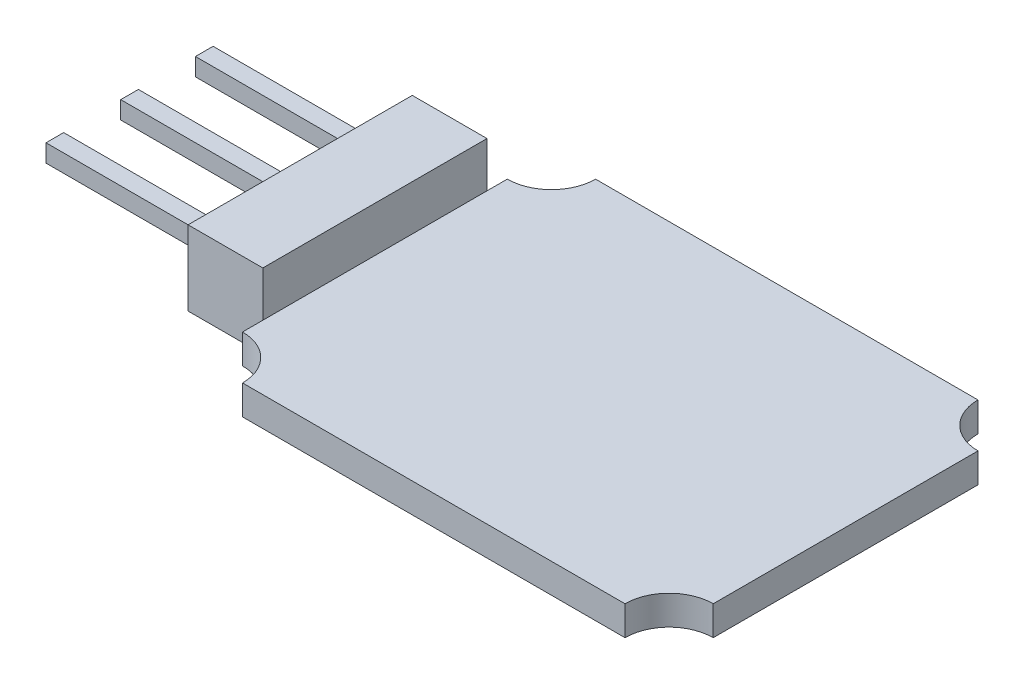
ISO-10303-21;
HEADER;
FILE_DESCRIPTION(('STEP AP214'),'2;1');
FILE_NAME('part.step','',(''),(''),'','','');
FILE_SCHEMA(('AUTOMOTIVE_DESIGN { 1 0 10303 214 1 1 1 1 }'));
ENDSEC;
DATA;
#1=APPLICATION_CONTEXT('core data for automotive mechanical design processes');
#2=APPLICATION_PROTOCOL_DEFINITION('international standard','automotive_design',2000,#1);
#3=PRODUCT_CONTEXT('',#1,'mechanical');
#4=PRODUCT('Part','Part','',(#3));
#5=PRODUCT_RELATED_PRODUCT_CATEGORY('part','',(#4));
#6=PRODUCT_DEFINITION_FORMATION('','',#4);
#7=PRODUCT_DEFINITION_CONTEXT('part definition',#1,'design');
#8=PRODUCT_DEFINITION('design','',#6,#7);
#9=PRODUCT_DEFINITION_SHAPE('','',#8);
#10=(LENGTH_UNIT() NAMED_UNIT(*) SI_UNIT(.MILLI.,.METRE.));
#11=(NAMED_UNIT(*) PLANE_ANGLE_UNIT() SI_UNIT($,.RADIAN.));
#12=(NAMED_UNIT(*) SI_UNIT($,.STERADIAN.) SOLID_ANGLE_UNIT());
#13=UNCERTAINTY_MEASURE_WITH_UNIT(LENGTH_MEASURE(1.E-05),#10,'distance_accuracy_value','');
#14=(GEOMETRIC_REPRESENTATION_CONTEXT(3) GLOBAL_UNCERTAINTY_ASSIGNED_CONTEXT((#13)) GLOBAL_UNIT_ASSIGNED_CONTEXT((#10,
#11,#12)) REPRESENTATION_CONTEXT('',''));
#15=CARTESIAN_POINT('',(0.,0.,0.));
#16=DIRECTION('',(0.,0.,1.));
#17=DIRECTION('',(1.,0.,0.));
#18=AXIS2_PLACEMENT_3D('',#15,#16,#17);
#19=CARTESIAN_POINT('',(-10.54,0.,-3.81));
#20=DIRECTION('',(1.,0.,0.));
#21=DIRECTION('',(0.,0.,-1.));
#22=AXIS2_PLACEMENT_3D('',#19,#20,#21);
#23=PLANE('',#22);
#24=DIRECTION('',(0.,-1.,0.));
#25=VECTOR('',#24,1.);
#26=CARTESIAN_POINT('',(-10.54,1.57,-0.3));
#27=LINE('',#26,#25);
#28=CARTESIAN_POINT('',(-10.54,1.57,-0.3));
#29=VERTEX_POINT('',#28);
#30=CARTESIAN_POINT('',(-10.54,0.970000000000001,-0.299999999999999));
#31=VERTEX_POINT('',#30);
#32=EDGE_CURVE('E271',#29,#31,#27,.T.);
#33=ORIENTED_EDGE('',*,*,#32,.F.);
#34=DIRECTION('',(0.,0.,-1.));
#35=VECTOR('',#34,1.);
#36=CARTESIAN_POINT('',(-10.54,1.57,-0.3));
#37=LINE('',#36,#35);
#38=CARTESIAN_POINT('',(-10.54,1.57,0.300000000000001));
#39=VERTEX_POINT('',#38);
#40=EDGE_CURVE('E280',#39,#29,#37,.T.);
#41=ORIENTED_EDGE('',*,*,#40,.F.);
#42=DIRECTION('',(0.,1.,0.));
#43=VECTOR('',#42,1.);
#44=CARTESIAN_POINT('',(-10.54,1.57,0.3));
#45=LINE('',#44,#43);
#46=CARTESIAN_POINT('',(-10.54,0.970000000000001,0.3));
#47=VERTEX_POINT('',#46);
#48=EDGE_CURVE('E277',#47,#39,#45,.T.);
#49=ORIENTED_EDGE('',*,*,#48,.F.);
#50=DIRECTION('',(0.,0.,1.));
#51=VECTOR('',#50,1.);
#52=CARTESIAN_POINT('',(-10.54,0.970000000000001,-0.3));
#53=LINE('',#52,#51);
#54=EDGE_CURVE('E274',#31,#47,#53,.T.);
#55=ORIENTED_EDGE('',*,*,#54,.F.);
#56=EDGE_LOOP('',(#33,#41,#49,#55));
#57=FACE_BOUND('',#56,.T.);
#58=DIRECTION('',(0.,1.,0.));
#59=VECTOR('',#58,1.);
#60=CARTESIAN_POINT('',(-10.54,0.,3.81));
#61=LINE('',#60,#59);
#62=CARTESIAN_POINT('',(-10.54,0.,3.81));
#63=VERTEX_POINT('',#62);
#64=CARTESIAN_POINT('',(-10.54,2.54,3.81));
#65=VERTEX_POINT('',#64);
#66=EDGE_CURVE('E329',#63,#65,#61,.T.);
#67=ORIENTED_EDGE('',*,*,#66,.T.);
#68=DIRECTION('',(0.,0.,1.));
#69=VECTOR('',#68,1.);
#70=CARTESIAN_POINT('',(-10.54,2.54,-3.81));
#71=LINE('',#70,#69);
#72=CARTESIAN_POINT('',(-10.54,2.54,-3.81));
#73=VERTEX_POINT('',#72);
#74=EDGE_CURVE('E334',#73,#65,#71,.T.);
#75=ORIENTED_EDGE('',*,*,#74,.F.);
#76=DIRECTION('',(0.,1.,0.));
#77=VECTOR('',#76,1.);
#78=CARTESIAN_POINT('',(-10.54,0.,-3.81));
#79=LINE('',#78,#77);
#80=CARTESIAN_POINT('',(-10.54,0.,-3.81));
#81=VERTEX_POINT('',#80);
#82=EDGE_CURVE('E319',#81,#73,#79,.T.);
#83=ORIENTED_EDGE('',*,*,#82,.F.);
#84=DIRECTION('',(0.,0.,1.));
#85=VECTOR('',#84,1.);
#86=CARTESIAN_POINT('',(-10.54,0.,-3.81));
#87=LINE('',#86,#85);
#88=EDGE_CURVE('E337',#81,#63,#87,.T.);
#89=ORIENTED_EDGE('',*,*,#88,.T.);
#90=EDGE_LOOP('',(#67,#75,#83,#89));
#91=FACE_BOUND('',#90,.T.);
#92=DIRECTION('',(0.,-1.,0.));
#93=VECTOR('',#92,1.);
#94=CARTESIAN_POINT('',(-10.54,1.57,-2.84));
#95=LINE('',#94,#93);
#96=CARTESIAN_POINT('',(-10.54,1.57,-2.84));
#97=VERTEX_POINT('',#96);
#98=CARTESIAN_POINT('',(-10.54,0.970000000000001,-2.84));
#99=VERTEX_POINT('',#98);
#100=EDGE_CURVE('E291',#97,#99,#95,.T.);
#101=ORIENTED_EDGE('',*,*,#100,.F.);
#102=DIRECTION('',(0.,0.,-1.));
#103=VECTOR('',#102,1.);
#104=CARTESIAN_POINT('',(-10.54,1.57,-2.84));
#105=LINE('',#104,#103);
#106=CARTESIAN_POINT('',(-10.54,1.57,-2.24));
#107=VERTEX_POINT('',#106);
#108=EDGE_CURVE('E300',#107,#97,#105,.T.);
#109=ORIENTED_EDGE('',*,*,#108,.F.);
#110=DIRECTION('',(0.,1.,0.));
#111=VECTOR('',#110,1.);
#112=CARTESIAN_POINT('',(-10.54,1.57,-2.24));
#113=LINE('',#112,#111);
#114=CARTESIAN_POINT('',(-10.54,0.970000000000001,-2.24));
#115=VERTEX_POINT('',#114);
#116=EDGE_CURVE('E297',#115,#107,#113,.T.);
#117=ORIENTED_EDGE('',*,*,#116,.F.);
#118=DIRECTION('',(0.,0.,1.));
#119=VECTOR('',#118,1.);
#120=CARTESIAN_POINT('',(-10.54,0.970000000000001,-2.84));
#121=LINE('',#120,#119);
#122=EDGE_CURVE('E294',#99,#115,#121,.T.);
#123=ORIENTED_EDGE('',*,*,#122,.F.);
#124=EDGE_LOOP('',(#101,#109,#117,#123));
#125=FACE_BOUND('',#124,.T.);
#126=DIRECTION('',(0.,-1.,0.));
#127=VECTOR('',#126,1.);
#128=CARTESIAN_POINT('',(-10.54,1.57,2.24));
#129=LINE('',#128,#127);
#130=CARTESIAN_POINT('',(-10.54,1.57,2.24));
#131=VERTEX_POINT('',#130);
#132=CARTESIAN_POINT('',(-10.54,0.970000000000001,2.24));
#133=VERTEX_POINT('',#132);
#134=EDGE_CURVE('E240',#131,#133,#129,.T.);
#135=ORIENTED_EDGE('',*,*,#134,.F.);
#136=DIRECTION('',(0.,0.,-1.));
#137=VECTOR('',#136,1.);
#138=CARTESIAN_POINT('',(-10.54,1.57,2.24));
#139=LINE('',#138,#137);
#140=CARTESIAN_POINT('',(-10.54,1.57,2.84));
#141=VERTEX_POINT('',#140);
#142=EDGE_CURVE('E248',#141,#131,#139,.T.);
#143=ORIENTED_EDGE('',*,*,#142,.F.);
#144=DIRECTION('',(0.,1.,0.));
#145=VECTOR('',#144,1.);
#146=CARTESIAN_POINT('',(-10.54,1.57,2.84));
#147=LINE('',#146,#145);
#148=CARTESIAN_POINT('',(-10.54,0.970000000000001,2.84));
#149=VERTEX_POINT('',#148);
#150=EDGE_CURVE('E261',#149,#141,#147,.T.);
#151=ORIENTED_EDGE('',*,*,#150,.F.);
#152=DIRECTION('',(0.,0.,1.));
#153=VECTOR('',#152,1.);
#154=CARTESIAN_POINT('',(-10.54,0.970000000000001,2.24));
#155=LINE('',#154,#153);
#156=EDGE_CURVE('E256',#133,#149,#155,.T.);
#157=ORIENTED_EDGE('',*,*,#156,.F.);
#158=EDGE_LOOP('',(#135,#143,#151,#157));
#159=FACE_BOUND('',#158,.T.);
#160=ADVANCED_FACE('F32',(#57,#91,#125,#159),#23,.F.);
#161=CARTESIAN_POINT('',(-8.,1.,4.5));
#162=DIRECTION('',(1.,0.,0.));
#163=DIRECTION('',(0.,0.,-1.));
#164=AXIS2_PLACEMENT_3D('',#161,#162,#163);
#165=PLANE('',#164);
#166=DIRECTION('',(0.,-1.,0.));
#167=VECTOR('',#166,1.);
#168=CARTESIAN_POINT('',(-8.,0.,-3.81));
#169=LINE('',#168,#167);
#170=CARTESIAN_POINT('',(-8.,1.,-3.81));
#171=VERTEX_POINT('',#170);
#172=CARTESIAN_POINT('',(-8.,0.,-3.81));
#173=VERTEX_POINT('',#172);
#174=EDGE_CURVE('E317',#171,#173,#169,.T.);
#175=ORIENTED_EDGE('',*,*,#174,.F.);
#176=DIRECTION('',(0.,0.,1.));
#177=VECTOR('',#176,1.);
#178=CARTESIAN_POINT('',(-8.,1.,4.5));
#179=LINE('',#178,#177);
#180=CARTESIAN_POINT('',(-8.,1.,-4.5));
#181=VERTEX_POINT('',#180);
#182=EDGE_CURVE('E358',#181,#171,#179,.T.);
#183=ORIENTED_EDGE('',*,*,#182,.F.);
#184=DIRECTION('',(0.,-1.,0.));
#185=VECTOR('',#184,1.);
#186=CARTESIAN_POINT('',(-8.,1.,-4.5));
#187=LINE('',#186,#185);
#188=CARTESIAN_POINT('',(-8.,0.,-4.5));
#189=VERTEX_POINT('',#188);
#190=EDGE_CURVE('E381',#181,#189,#187,.T.);
#191=ORIENTED_EDGE('',*,*,#190,.T.);
#192=DIRECTION('',(0.,0.,1.));
#193=VECTOR('',#192,1.);
#194=CARTESIAN_POINT('',(-8.,0.,4.5));
#195=LINE('',#194,#193);
#196=EDGE_CURVE('E345',#189,#173,#195,.T.);
#197=ORIENTED_EDGE('',*,*,#196,.T.);
#198=EDGE_LOOP('',(#175,#183,#191,#197));
#199=FACE_BOUND('',#198,.T.);
#200=ADVANCED_FACE('F514',(#199),#165,.F.);
#201=CARTESIAN_POINT('',(-8.,1.,6.));
#202=DIRECTION('',(0.,-1.,0.));
#203=DIRECTION('',(0.,0.,-1.));
#204=AXIS2_PLACEMENT_3D('',#201,#202,#203);
#205=CYLINDRICAL_SURFACE('',#204,1.5);
#206=CARTESIAN_POINT('',(-8.,0.,6.));
#207=DIRECTION('',(0.,-1.,0.));
#208=DIRECTION('',(0.,0.,1.));
#209=AXIS2_PLACEMENT_3D('',#206,#207,#208);
#210=CIRCLE('',#209,1.5);
#211=CARTESIAN_POINT('',(-8.,0.,4.5));
#212=VERTEX_POINT('',#211);
#213=CARTESIAN_POINT('',(-6.5,0.,6.));
#214=VERTEX_POINT('',#213);
#215=EDGE_CURVE('E340',#212,#214,#210,.T.);
#216=ORIENTED_EDGE('',*,*,#215,.T.);
#217=DIRECTION('',(0.,-1.,0.));
#218=VECTOR('',#217,1.);
#219=CARTESIAN_POINT('',(-6.5,1.,6.));
#220=LINE('',#219,#218);
#221=CARTESIAN_POINT('',(-6.5,1.,6.));
#222=VERTEX_POINT('',#221);
#223=EDGE_CURVE('E399',#222,#214,#220,.T.);
#224=ORIENTED_EDGE('',*,*,#223,.F.);
#225=CARTESIAN_POINT('',(-8.,1.,6.));
#226=DIRECTION('',(0.,-1.,0.));
#227=DIRECTION('',(0.,0.,1.));
#228=AXIS2_PLACEMENT_3D('',#225,#226,#227);
#229=CIRCLE('',#228,1.5);
#230=CARTESIAN_POINT('',(-8.,1.,4.5));
#231=VERTEX_POINT('',#230);
#232=EDGE_CURVE('E341',#231,#222,#229,.T.);
#233=ORIENTED_EDGE('',*,*,#232,.F.);
#234=DIRECTION('',(0.,-1.,0.));
#235=VECTOR('',#234,1.);
#236=CARTESIAN_POINT('',(-8.,1.,4.5));
#237=LINE('',#236,#235);
#238=EDGE_CURVE('E361',#231,#212,#237,.T.);
#239=ORIENTED_EDGE('',*,*,#238,.T.);
#240=EDGE_LOOP('',(#216,#224,#233,#239));
#241=FACE_BOUND('',#240,.T.);
#242=ADVANCED_FACE('F520',(#241),#205,.F.);
#243=CARTESIAN_POINT('',(-6.5,1.,6.));
#244=DIRECTION('',(0.,0.,-1.));
#245=DIRECTION('',(-1.,0.,0.));
#246=AXIS2_PLACEMENT_3D('',#243,#244,#245);
#247=PLANE('',#246);
#248=DIRECTION('',(1.,0.,0.));
#249=VECTOR('',#248,1.);
#250=CARTESIAN_POINT('',(-6.5,0.,6.));
#251=LINE('',#250,#249);
#252=CARTESIAN_POINT('',(6.5,0.,6.));
#253=VERTEX_POINT('',#252);
#254=EDGE_CURVE('E365',#214,#253,#251,.T.);
#255=ORIENTED_EDGE('',*,*,#254,.T.);
#256=DIRECTION('',(0.,-1.,0.));
#257=VECTOR('',#256,1.);
#258=CARTESIAN_POINT('',(6.5,1.,6.));
#259=LINE('',#258,#257);
#260=CARTESIAN_POINT('',(6.5,1.,6.));
#261=VERTEX_POINT('',#260);
#262=EDGE_CURVE('E396',#261,#253,#259,.T.);
#263=ORIENTED_EDGE('',*,*,#262,.F.);
#264=DIRECTION('',(1.,0.,0.));
#265=VECTOR('',#264,1.);
#266=CARTESIAN_POINT('',(-6.5,1.,6.));
#267=LINE('',#266,#265);
#268=EDGE_CURVE('E344',#222,#261,#267,.T.);
#269=ORIENTED_EDGE('',*,*,#268,.F.);
#270=ORIENTED_EDGE('',*,*,#223,.T.);
#271=EDGE_LOOP('',(#255,#263,#269,#270));
#272=FACE_BOUND('',#271,.T.);
#273=ADVANCED_FACE('F563',(#272),#247,.F.);
#274=CARTESIAN_POINT('',(8.,1.,6.));
#275=DIRECTION('',(0.,-1.,0.));
#276=DIRECTION('',(0.,0.,-1.));
#277=AXIS2_PLACEMENT_3D('',#274,#275,#276);
#278=CYLINDRICAL_SURFACE('',#277,1.5);
#279=CARTESIAN_POINT('',(8.,0.,6.));
#280=DIRECTION('',(0.,-1.,0.));
#281=DIRECTION('',(0.,0.,1.));
#282=AXIS2_PLACEMENT_3D('',#279,#280,#281);
#283=CIRCLE('',#282,1.5);
#284=CARTESIAN_POINT('',(8.,0.,4.5));
#285=VERTEX_POINT('',#284);
#286=EDGE_CURVE('E367',#253,#285,#283,.T.);
#287=ORIENTED_EDGE('',*,*,#286,.T.);
#288=DIRECTION('',(0.,-1.,0.));
#289=VECTOR('',#288,1.);
#290=CARTESIAN_POINT('',(8.,1.,4.5));
#291=LINE('',#290,#289);
#292=CARTESIAN_POINT('',(8.,1.,4.5));
#293=VERTEX_POINT('',#292);
#294=EDGE_CURVE('E393',#293,#285,#291,.T.);
#295=ORIENTED_EDGE('',*,*,#294,.F.);
#296=CARTESIAN_POINT('',(8.,1.,6.));
#297=DIRECTION('',(0.,-1.,0.));
#298=DIRECTION('',(0.,0.,1.));
#299=AXIS2_PLACEMENT_3D('',#296,#297,#298);
#300=CIRCLE('',#299,1.5);
#301=EDGE_CURVE('E347',#261,#293,#300,.T.);
#302=ORIENTED_EDGE('',*,*,#301,.F.);
#303=ORIENTED_EDGE('',*,*,#262,.T.);
#304=EDGE_LOOP('',(#287,#295,#302,#303));
#305=FACE_BOUND('',#304,.T.);
#306=ADVANCED_FACE('F559',(#305),#278,.F.);
#307=CARTESIAN_POINT('',(8.,1.,4.5));
#308=DIRECTION('',(-1.,0.,0.));
#309=DIRECTION('',(0.,0.,1.));
#310=AXIS2_PLACEMENT_3D('',#307,#308,#309);
#311=PLANE('',#310);
#312=DIRECTION('',(0.,0.,-1.));
#313=VECTOR('',#312,1.);
#314=CARTESIAN_POINT('',(8.,0.,4.5));
#315=LINE('',#314,#313);
#316=CARTESIAN_POINT('',(8.,0.,-4.5));
#317=VERTEX_POINT('',#316);
#318=EDGE_CURVE('E369',#285,#317,#315,.T.);
#319=ORIENTED_EDGE('',*,*,#318,.T.);
#320=DIRECTION('',(0.,-1.,0.));
#321=VECTOR('',#320,1.);
#322=CARTESIAN_POINT('',(8.,1.,-4.5));
#323=LINE('',#322,#321);
#324=CARTESIAN_POINT('',(8.,1.,-4.5));
#325=VERTEX_POINT('',#324);
#326=EDGE_CURVE('E390',#325,#317,#323,.T.);
#327=ORIENTED_EDGE('',*,*,#326,.F.);
#328=DIRECTION('',(0.,0.,-1.));
#329=VECTOR('',#328,1.);
#330=CARTESIAN_POINT('',(8.,1.,4.5));
#331=LINE('',#330,#329);
#332=EDGE_CURVE('E349',#293,#325,#331,.T.);
#333=ORIENTED_EDGE('',*,*,#332,.F.);
#334=ORIENTED_EDGE('',*,*,#294,.T.);
#335=EDGE_LOOP('',(#319,#327,#333,#334));
#336=FACE_BOUND('',#335,.T.);
#337=ADVANCED_FACE('F555',(#336),#311,.F.);
#338=CARTESIAN_POINT('',(8.,1.,-6.));
#339=DIRECTION('',(0.,-1.,0.));
#340=DIRECTION('',(0.,0.,-1.));
#341=AXIS2_PLACEMENT_3D('',#338,#339,#340);
#342=CYLINDRICAL_SURFACE('',#341,1.5);
#343=CARTESIAN_POINT('',(8.,0.,-6.));
#344=DIRECTION('',(0.,-1.,0.));
#345=DIRECTION('',(0.,0.,1.));
#346=AXIS2_PLACEMENT_3D('',#343,#344,#345);
#347=CIRCLE('',#346,1.5);
#348=CARTESIAN_POINT('',(6.5,0.,-6.));
#349=VERTEX_POINT('',#348);
#350=EDGE_CURVE('E371',#317,#349,#347,.T.);
#351=ORIENTED_EDGE('',*,*,#350,.T.);
#352=DIRECTION('',(0.,-1.,0.));
#353=VECTOR('',#352,1.);
#354=CARTESIAN_POINT('',(6.5,1.,-6.));
#355=LINE('',#354,#353);
#356=CARTESIAN_POINT('',(6.5,1.,-6.));
#357=VERTEX_POINT('',#356);
#358=EDGE_CURVE('E387',#357,#349,#355,.T.);
#359=ORIENTED_EDGE('',*,*,#358,.F.);
#360=CARTESIAN_POINT('',(8.,1.,-6.));
#361=DIRECTION('',(0.,-1.,0.));
#362=DIRECTION('',(0.,0.,1.));
#363=AXIS2_PLACEMENT_3D('',#360,#361,#362);
#364=CIRCLE('',#363,1.5);
#365=EDGE_CURVE('E351',#325,#357,#364,.T.);
#366=ORIENTED_EDGE('',*,*,#365,.F.);
#367=ORIENTED_EDGE('',*,*,#326,.T.);
#368=EDGE_LOOP('',(#351,#359,#366,#367));
#369=FACE_BOUND('',#368,.T.);
#370=ADVANCED_FACE('F551',(#369),#342,.F.);
#371=CARTESIAN_POINT('',(-6.5,1.,-6.));
#372=DIRECTION('',(0.,0.,1.));
#373=DIRECTION('',(1.,0.,0.));
#374=AXIS2_PLACEMENT_3D('',#371,#372,#373);
#375=PLANE('',#374);
#376=DIRECTION('',(-1.,0.,0.));
#377=VECTOR('',#376,1.);
#378=CARTESIAN_POINT('',(-6.5,0.,-6.));
#379=LINE('',#378,#377);
#380=CARTESIAN_POINT('',(-6.5,0.,-6.));
#381=VERTEX_POINT('',#380);
#382=EDGE_CURVE('E373',#349,#381,#379,.T.);
#383=ORIENTED_EDGE('',*,*,#382,.T.);
#384=DIRECTION('',(0.,-1.,0.));
#385=VECTOR('',#384,1.);
#386=CARTESIAN_POINT('',(-6.5,1.,-6.));
#387=LINE('',#386,#385);
#388=CARTESIAN_POINT('',(-6.5,1.,-6.));
#389=VERTEX_POINT('',#388);
#390=EDGE_CURVE('E384',#389,#381,#387,.T.);
#391=ORIENTED_EDGE('',*,*,#390,.F.);
#392=DIRECTION('',(-1.,0.,0.));
#393=VECTOR('',#392,1.);
#394=CARTESIAN_POINT('',(-6.5,1.,-6.));
#395=LINE('',#394,#393);
#396=EDGE_CURVE('E353',#357,#389,#395,.T.);
#397=ORIENTED_EDGE('',*,*,#396,.F.);
#398=ORIENTED_EDGE('',*,*,#358,.T.);
#399=EDGE_LOOP('',(#383,#391,#397,#398));
#400=FACE_BOUND('',#399,.T.);
#401=ADVANCED_FACE('F547',(#400),#375,.F.);
#402=CARTESIAN_POINT('',(-8.,1.,-6.));
#403=DIRECTION('',(0.,-1.,0.));
#404=DIRECTION('',(0.,0.,-1.));
#405=AXIS2_PLACEMENT_3D('',#402,#403,#404);
#406=CYLINDRICAL_SURFACE('',#405,1.5);
#407=CARTESIAN_POINT('',(-8.,0.,-6.));
#408=DIRECTION('',(0.,-1.,0.));
#409=DIRECTION('',(0.,0.,1.));
#410=AXIS2_PLACEMENT_3D('',#407,#408,#409);
#411=CIRCLE('',#410,1.5);
#412=EDGE_CURVE('E375',#381,#189,#411,.T.);
#413=ORIENTED_EDGE('',*,*,#412,.T.);
#414=ORIENTED_EDGE('',*,*,#190,.F.);
#415=CARTESIAN_POINT('',(-8.,1.,-6.));
#416=DIRECTION('',(0.,-1.,0.));
#417=DIRECTION('',(0.,0.,1.));
#418=AXIS2_PLACEMENT_3D('',#415,#416,#417);
#419=CIRCLE('',#418,1.5);
#420=EDGE_CURVE('E355',#389,#181,#419,.T.);
#421=ORIENTED_EDGE('',*,*,#420,.F.);
#422=ORIENTED_EDGE('',*,*,#390,.T.);
#423=EDGE_LOOP('',(#413,#414,#421,#422));
#424=FACE_BOUND('',#423,.T.);
#425=ADVANCED_FACE('F543',(#424),#406,.F.);
#426=CARTESIAN_POINT('',(-8.,1.,3.81));
#427=VERTEX_POINT('',#426);
#428=EDGE_CURVE('E357',#427,#231,#179,.T.);
#429=ORIENTED_EDGE('',*,*,#428,.F.);
#430=DIRECTION('',(0.,-1.,0.));
#431=VECTOR('',#430,1.);
#432=CARTESIAN_POINT('',(-8.,0.,3.81));
#433=LINE('',#432,#431);
#434=CARTESIAN_POINT('',(-8.,0.,3.81));
#435=VERTEX_POINT('',#434);
#436=EDGE_CURVE('E327',#427,#435,#433,.T.);
#437=ORIENTED_EDGE('',*,*,#436,.T.);
#438=EDGE_CURVE('E377',#435,#212,#195,.T.);
#439=ORIENTED_EDGE('',*,*,#438,.T.);
#440=ORIENTED_EDGE('',*,*,#238,.F.);
#441=EDGE_LOOP('',(#429,#437,#439,#440));
#442=FACE_BOUND('',#441,.T.);
#443=ADVANCED_FACE('F523',(#442),#165,.F.);
#444=CARTESIAN_POINT('',(-8.,1.,6.));
#445=DIRECTION('',(0.,1.,0.));
#446=DIRECTION('',(0.,0.,1.));
#447=AXIS2_PLACEMENT_3D('',#444,#445,#446);
#448=PLANE('',#447);
#449=ORIENTED_EDGE('',*,*,#232,.T.);
#450=ORIENTED_EDGE('',*,*,#268,.T.);
#451=ORIENTED_EDGE('',*,*,#301,.T.);
#452=ORIENTED_EDGE('',*,*,#332,.T.);
#453=ORIENTED_EDGE('',*,*,#365,.T.);
#454=ORIENTED_EDGE('',*,*,#396,.T.);
#455=ORIENTED_EDGE('',*,*,#420,.T.);
#456=ORIENTED_EDGE('',*,*,#182,.T.);
#457=EDGE_CURVE('E362',#171,#427,#179,.T.);
#458=ORIENTED_EDGE('',*,*,#457,.T.);
#459=ORIENTED_EDGE('',*,*,#428,.T.);
#460=EDGE_LOOP('',(#449,#450,#451,#452,#453,#454,#455,#456,#458,#459));
#461=FACE_BOUND('',#460,.T.);
#462=ADVANCED_FACE('F535',(#461),#448,.T.);
#463=CARTESIAN_POINT('',(-8.,0.,6.));
#464=DIRECTION('',(0.,1.,0.));
#465=DIRECTION('',(0.,0.,1.));
#466=AXIS2_PLACEMENT_3D('',#463,#464,#465);
#467=PLANE('',#466);
#468=ORIENTED_EDGE('',*,*,#215,.F.);
#469=ORIENTED_EDGE('',*,*,#438,.F.);
#470=DIRECTION('',(-1.,0.,0.));
#471=VECTOR('',#470,1.);
#472=CARTESIAN_POINT('',(-8.,0.,3.81));
#473=LINE('',#472,#471);
#474=EDGE_CURVE('E326',#435,#63,#473,.T.);
#475=ORIENTED_EDGE('',*,*,#474,.T.);
#476=ORIENTED_EDGE('',*,*,#88,.F.);
#477=DIRECTION('',(-1.,0.,0.));
#478=VECTOR('',#477,1.);
#479=CARTESIAN_POINT('',(-8.,0.,-3.81));
#480=LINE('',#479,#478);
#481=EDGE_CURVE('E315',#173,#81,#480,.T.);
#482=ORIENTED_EDGE('',*,*,#481,.F.);
#483=ORIENTED_EDGE('',*,*,#196,.F.);
#484=ORIENTED_EDGE('',*,*,#412,.F.);
#485=ORIENTED_EDGE('',*,*,#382,.F.);
#486=ORIENTED_EDGE('',*,*,#350,.F.);
#487=ORIENTED_EDGE('',*,*,#318,.F.);
#488=ORIENTED_EDGE('',*,*,#286,.F.);
#489=ORIENTED_EDGE('',*,*,#254,.F.);
#490=EDGE_LOOP('',(#468,#469,#475,#476,#482,#483,#484,#485,#486,#487,#488,#489));
#491=FACE_BOUND('',#490,.T.);
#492=ADVANCED_FACE('F533',(#491),#467,.F.);
#493=CARTESIAN_POINT('',(-8.,0.,-3.81));
#494=DIRECTION('',(-1.,0.,0.));
#495=DIRECTION('',(0.,0.,1.));
#496=AXIS2_PLACEMENT_3D('',#493,#494,#495);
#497=PLANE('',#496);
#498=ORIENTED_EDGE('',*,*,#457,.F.);
#499=CARTESIAN_POINT('',(-8.,2.54,-3.81));
#500=VERTEX_POINT('',#499);
#501=EDGE_CURVE('E312',#500,#171,#169,.T.);
#502=ORIENTED_EDGE('',*,*,#501,.F.);
#503=DIRECTION('',(0.,0.,1.));
#504=VECTOR('',#503,1.);
#505=CARTESIAN_POINT('',(-8.,2.54,-3.81));
#506=LINE('',#505,#504);
#507=CARTESIAN_POINT('',(-8.,2.54,3.81));
#508=VERTEX_POINT('',#507);
#509=EDGE_CURVE('E323',#500,#508,#506,.T.);
#510=ORIENTED_EDGE('',*,*,#509,.T.);
#511=EDGE_CURVE('E311',#508,#427,#433,.T.);
#512=ORIENTED_EDGE('',*,*,#511,.T.);
#513=EDGE_LOOP('',(#498,#502,#510,#512));
#514=FACE_BOUND('',#513,.T.);
#515=ADVANCED_FACE('F530',(#514),#497,.F.);
#516=CARTESIAN_POINT('',(-8.,2.54,-3.81));
#517=DIRECTION('',(0.,-1.,0.));
#518=DIRECTION('',(0.,0.,-1.));
#519=AXIS2_PLACEMENT_3D('',#516,#517,#518);
#520=PLANE('',#519);
#521=DIRECTION('',(1.,0.,0.));
#522=VECTOR('',#521,1.);
#523=CARTESIAN_POINT('',(-8.,2.54,3.81));
#524=LINE('',#523,#522);
#525=EDGE_CURVE('E316',#65,#508,#524,.T.);
#526=ORIENTED_EDGE('',*,*,#525,.T.);
#527=ORIENTED_EDGE('',*,*,#509,.F.);
#528=DIRECTION('',(1.,0.,0.));
#529=VECTOR('',#528,1.);
#530=CARTESIAN_POINT('',(-8.,2.54,-3.81));
#531=LINE('',#530,#529);
#532=EDGE_CURVE('E321',#73,#500,#531,.T.);
#533=ORIENTED_EDGE('',*,*,#532,.F.);
#534=ORIENTED_EDGE('',*,*,#74,.T.);
#535=EDGE_LOOP('',(#526,#527,#533,#534));
#536=FACE_BOUND('',#535,.T.);
#537=ADVANCED_FACE('F528',(#536),#520,.F.);
#538=CARTESIAN_POINT('',(0.,0.,-3.81));
#539=DIRECTION('',(0.,0.,1.));
#540=DIRECTION('',(1.,0.,0.));
#541=AXIS2_PLACEMENT_3D('',#538,#539,#540);
#542=PLANE('',#541);
#543=ORIENTED_EDGE('',*,*,#501,.T.);
#544=ORIENTED_EDGE('',*,*,#174,.T.);
#545=ORIENTED_EDGE('',*,*,#481,.T.);
#546=ORIENTED_EDGE('',*,*,#82,.T.);
#547=ORIENTED_EDGE('',*,*,#532,.T.);
#548=EDGE_LOOP('',(#543,#544,#545,#546,#547));
#549=FACE_BOUND('',#548,.T.);
#550=ADVANCED_FACE('F764',(#549),#542,.F.);
#551=CARTESIAN_POINT('',(0.,0.,3.81));
#552=DIRECTION('',(0.,0.,1.));
#553=DIRECTION('',(1.,0.,0.));
#554=AXIS2_PLACEMENT_3D('',#551,#552,#553);
#555=PLANE('',#554);
#556=ORIENTED_EDGE('',*,*,#511,.F.);
#557=ORIENTED_EDGE('',*,*,#525,.F.);
#558=ORIENTED_EDGE('',*,*,#66,.F.);
#559=ORIENTED_EDGE('',*,*,#474,.F.);
#560=ORIENTED_EDGE('',*,*,#436,.F.);
#561=EDGE_LOOP('',(#556,#557,#558,#559,#560));
#562=FACE_BOUND('',#561,.T.);
#563=ADVANCED_FACE('F750',(#562),#555,.T.);
#564=CARTESIAN_POINT('',(-16.54,1.57,-2.84));
#565=DIRECTION('',(0.,0.,1.));
#566=DIRECTION('',(1.,0.,0.));
#567=AXIS2_PLACEMENT_3D('',#564,#565,#566);
#568=PLANE('',#567);
#569=DIRECTION('',(1.,0.,0.));
#570=VECTOR('',#569,1.);
#571=CARTESIAN_POINT('',(-16.54,0.970000000000001,-2.84));
#572=LINE('',#571,#570);
#573=CARTESIAN_POINT('',(-16.34,0.970000000000001,-2.84));
#574=VERTEX_POINT('',#573);
#575=EDGE_CURVE('E309',#574,#99,#572,.T.);
#576=ORIENTED_EDGE('',*,*,#575,.F.);
#577=DIRECTION('',(0.,1.,0.));
#578=VECTOR('',#577,1.);
#579=CARTESIAN_POINT('',(-16.34,1.57,-2.84));
#580=LINE('',#579,#578);
#581=CARTESIAN_POINT('',(-16.34,1.57,-2.84));
#582=VERTEX_POINT('',#581);
#583=EDGE_CURVE('E11',#574,#582,#580,.T.);
#584=ORIENTED_EDGE('',*,*,#583,.T.);
#585=DIRECTION('',(1.,0.,0.));
#586=VECTOR('',#585,1.);
#587=CARTESIAN_POINT('',(-16.54,1.57,-2.84));
#588=LINE('',#587,#586);
#589=EDGE_CURVE('E303',#582,#97,#588,.T.);
#590=ORIENTED_EDGE('',*,*,#589,.T.);
#591=ORIENTED_EDGE('',*,*,#100,.T.);
#592=EDGE_LOOP('',(#576,#584,#590,#591));
#593=FACE_BOUND('',#592,.T.);
#594=ADVANCED_FACE('F490',(#593),#568,.F.);
#595=CARTESIAN_POINT('',(-16.54,0.970000000000001,-2.84));
#596=DIRECTION('',(0.,1.,0.));
#597=DIRECTION('',(0.,0.,1.));
#598=AXIS2_PLACEMENT_3D('',#595,#596,#597);
#599=PLANE('',#598);
#600=DIRECTION('',(1.,0.,0.));
#601=VECTOR('',#600,1.);
#602=CARTESIAN_POINT('',(-16.54,0.970000000000001,-2.24));
#603=LINE('',#602,#601);
#604=CARTESIAN_POINT('',(-16.34,0.970000000000001,-2.24));
#605=VERTEX_POINT('',#604);
#606=EDGE_CURVE('E307',#605,#115,#603,.T.);
#607=ORIENTED_EDGE('',*,*,#606,.F.);
#608=DIRECTION('',(0.,0.,-1.));
#609=VECTOR('',#608,1.);
#610=CARTESIAN_POINT('',(-16.34,0.970000000000001,-2.84));
#611=LINE('',#610,#609);
#612=EDGE_CURVE('E41',#605,#574,#611,.T.);
#613=ORIENTED_EDGE('',*,*,#612,.T.);
#614=ORIENTED_EDGE('',*,*,#575,.T.);
#615=ORIENTED_EDGE('',*,*,#122,.T.);
#616=EDGE_LOOP('',(#607,#613,#614,#615));
#617=FACE_BOUND('',#616,.T.);
#618=ADVANCED_FACE('F734',(#617),#599,.F.);
#619=CARTESIAN_POINT('',(-16.54,1.57,-2.24));
#620=DIRECTION('',(0.,0.,-1.));
#621=DIRECTION('',(-1.,0.,0.));
#622=AXIS2_PLACEMENT_3D('',#619,#620,#621);
#623=PLANE('',#622);
#624=DIRECTION('',(1.,0.,0.));
#625=VECTOR('',#624,1.);
#626=CARTESIAN_POINT('',(-16.54,1.57,-2.24));
#627=LINE('',#626,#625);
#628=CARTESIAN_POINT('',(-16.34,1.57,-2.24));
#629=VERTEX_POINT('',#628);
#630=EDGE_CURVE('E305',#629,#107,#627,.T.);
#631=ORIENTED_EDGE('',*,*,#630,.F.);
#632=DIRECTION('',(0.,-1.,0.));
#633=VECTOR('',#632,1.);
#634=CARTESIAN_POINT('',(-16.34,0.970000000000001,-2.24));
#635=LINE('',#634,#633);
#636=EDGE_CURVE('E56',#629,#605,#635,.T.);
#637=ORIENTED_EDGE('',*,*,#636,.T.);
#638=ORIENTED_EDGE('',*,*,#606,.T.);
#639=ORIENTED_EDGE('',*,*,#116,.T.);
#640=EDGE_LOOP('',(#631,#637,#638,#639));
#641=FACE_BOUND('',#640,.T.);
#642=ADVANCED_FACE('F511',(#641),#623,.F.);
#643=CARTESIAN_POINT('',(-16.54,1.57,-2.84));
#644=DIRECTION('',(0.,-1.,0.));
#645=DIRECTION('',(0.,0.,-1.));
#646=AXIS2_PLACEMENT_3D('',#643,#644,#645);
#647=PLANE('',#646);
#648=ORIENTED_EDGE('',*,*,#589,.F.);
#649=DIRECTION('',(0.,0.,1.));
#650=VECTOR('',#649,1.);
#651=CARTESIAN_POINT('',(-16.34,1.57,-2.24));
#652=LINE('',#651,#650);
#653=EDGE_CURVE('E445',#582,#629,#652,.T.);
#654=ORIENTED_EDGE('',*,*,#653,.T.);
#655=ORIENTED_EDGE('',*,*,#630,.T.);
#656=ORIENTED_EDGE('',*,*,#108,.T.);
#657=EDGE_LOOP('',(#648,#654,#655,#656));
#658=FACE_BOUND('',#657,.T.);
#659=ADVANCED_FACE('F494',(#658),#647,.F.);
#660=CARTESIAN_POINT('',(-16.54,0.,0.));
#661=DIRECTION('',(-1.,0.,0.));
#662=DIRECTION('',(0.,0.,1.));
#663=AXIS2_PLACEMENT_3D('',#660,#661,#662);
#664=PLANE('',#663);
#665=DIRECTION('',(0.,1.,0.));
#666=VECTOR('',#665,1.);
#667=CARTESIAN_POINT('',(-16.54,1.57,-2.44));
#668=LINE('',#667,#666);
#669=CARTESIAN_POINT('',(-16.54,1.17,-2.44));
#670=VERTEX_POINT('',#669);
#671=CARTESIAN_POINT('',(-16.54,1.37,-2.44));
#672=VERTEX_POINT('',#671);
#673=EDGE_CURVE('E440',#670,#672,#668,.T.);
#674=ORIENTED_EDGE('',*,*,#673,.T.);
#675=DIRECTION('',(0.,0.,-1.));
#676=VECTOR('',#675,1.);
#677=CARTESIAN_POINT('',(-16.54,1.37,-2.84));
#678=LINE('',#677,#676);
#679=CARTESIAN_POINT('',(-16.54,1.37,-2.64));
#680=VERTEX_POINT('',#679);
#681=EDGE_CURVE('E442',#672,#680,#678,.T.);
#682=ORIENTED_EDGE('',*,*,#681,.T.);
#683=DIRECTION('',(0.,-1.,0.));
#684=VECTOR('',#683,1.);
#685=CARTESIAN_POINT('',(-16.54,0.970000000000001,-2.64));
#686=LINE('',#685,#684);
#687=CARTESIAN_POINT('',(-16.54,1.17,-2.64));
#688=VERTEX_POINT('',#687);
#689=EDGE_CURVE('E436',#680,#688,#686,.T.);
#690=ORIENTED_EDGE('',*,*,#689,.T.);
#691=DIRECTION('',(0.,0.,1.));
#692=VECTOR('',#691,1.);
#693=CARTESIAN_POINT('',(-16.54,1.17,-2.24));
#694=LINE('',#693,#692);
#695=EDGE_CURVE('E438',#688,#670,#694,.T.);
#696=ORIENTED_EDGE('',*,*,#695,.T.);
#697=EDGE_LOOP('',(#674,#682,#690,#696));
#698=FACE_BOUND('',#697,.T.);
#699=ADVANCED_FACE('F500',(#698),#664,.T.);
#700=CARTESIAN_POINT('',(-16.54,1.57,-0.3));
#701=DIRECTION('',(0.,0.,1.));
#702=DIRECTION('',(0.,-1.,0.));
#703=AXIS2_PLACEMENT_3D('',#700,#701,#702);
#704=PLANE('',#703);
#705=DIRECTION('',(1.,0.,0.));
#706=VECTOR('',#705,1.);
#707=CARTESIAN_POINT('',(-16.54,0.970000000000001,-0.3));
#708=LINE('',#707,#706);
#709=CARTESIAN_POINT('',(-16.34,0.970000000000001,-0.3));
#710=VERTEX_POINT('',#709);
#711=EDGE_CURVE('E289',#710,#31,#708,.T.);
#712=ORIENTED_EDGE('',*,*,#711,.F.);
#713=DIRECTION('',(0.,1.,0.));
#714=VECTOR('',#713,1.);
#715=CARTESIAN_POINT('',(-16.34,1.57,-0.3));
#716=LINE('',#715,#714);
#717=CARTESIAN_POINT('',(-16.34,1.57,-0.3));
#718=VERTEX_POINT('',#717);
#719=EDGE_CURVE('E434',#710,#718,#716,.T.);
#720=ORIENTED_EDGE('',*,*,#719,.T.);
#721=DIRECTION('',(1.,0.,0.));
#722=VECTOR('',#721,1.);
#723=CARTESIAN_POINT('',(-16.54,1.57,-0.3));
#724=LINE('',#723,#722);
#725=EDGE_CURVE('E283',#718,#29,#724,.T.);
#726=ORIENTED_EDGE('',*,*,#725,.T.);
#727=ORIENTED_EDGE('',*,*,#32,.T.);
#728=EDGE_LOOP('',(#712,#720,#726,#727));
#729=FACE_BOUND('',#728,.T.);
#730=ADVANCED_FACE('F502',(#729),#704,.F.);
#731=CARTESIAN_POINT('',(-16.54,0.970000000000001,-0.3));
#732=DIRECTION('',(0.,1.,0.));
#733=DIRECTION('',(0.,0.,1.));
#734=AXIS2_PLACEMENT_3D('',#731,#732,#733);
#735=PLANE('',#734);
#736=DIRECTION('',(1.,0.,0.));
#737=VECTOR('',#736,1.);
#738=CARTESIAN_POINT('',(-16.54,0.970000000000001,0.3));
#739=LINE('',#738,#737);
#740=CARTESIAN_POINT('',(-16.34,0.970000000000001,0.3));
#741=VERTEX_POINT('',#740);
#742=EDGE_CURVE('E287',#741,#47,#739,.T.);
#743=ORIENTED_EDGE('',*,*,#742,.F.);
#744=DIRECTION('',(0.,0.,-1.));
#745=VECTOR('',#744,1.);
#746=CARTESIAN_POINT('',(-16.34,0.970000000000001,-0.3));
#747=LINE('',#746,#745);
#748=EDGE_CURVE('E432',#741,#710,#747,.T.);
#749=ORIENTED_EDGE('',*,*,#748,.T.);
#750=ORIENTED_EDGE('',*,*,#711,.T.);
#751=ORIENTED_EDGE('',*,*,#54,.T.);
#752=EDGE_LOOP('',(#743,#749,#750,#751));
#753=FACE_BOUND('',#752,.T.);
#754=ADVANCED_FACE('F508',(#753),#735,.F.);
#755=CARTESIAN_POINT('',(-16.54,1.57,0.3));
#756=DIRECTION('',(0.,0.,-1.));
#757=DIRECTION('',(0.,1.,0.));
#758=AXIS2_PLACEMENT_3D('',#755,#756,#757);
#759=PLANE('',#758);
#760=DIRECTION('',(1.,0.,0.));
#761=VECTOR('',#760,1.);
#762=CARTESIAN_POINT('',(-16.54,1.57,0.3));
#763=LINE('',#762,#761);
#764=CARTESIAN_POINT('',(-16.34,1.57,0.3));
#765=VERTEX_POINT('',#764);
#766=EDGE_CURVE('E285',#765,#39,#763,.T.);
#767=ORIENTED_EDGE('',*,*,#766,.F.);
#768=DIRECTION('',(0.,-1.,0.));
#769=VECTOR('',#768,1.);
#770=CARTESIAN_POINT('',(-16.34,0.970000000000001,0.3));
#771=LINE('',#770,#769);
#772=EDGE_CURVE('E430',#765,#741,#771,.T.);
#773=ORIENTED_EDGE('',*,*,#772,.T.);
#774=ORIENTED_EDGE('',*,*,#742,.T.);
#775=ORIENTED_EDGE('',*,*,#48,.T.);
#776=EDGE_LOOP('',(#767,#773,#774,#775));
#777=FACE_BOUND('',#776,.T.);
#778=ADVANCED_FACE('F695',(#777),#759,.F.);
#779=CARTESIAN_POINT('',(-16.54,1.57,-0.3));
#780=DIRECTION('',(0.,-1.,0.));
#781=DIRECTION('',(0.,0.,-1.));
#782=AXIS2_PLACEMENT_3D('',#779,#780,#781);
#783=PLANE('',#782);
#784=ORIENTED_EDGE('',*,*,#725,.F.);
#785=DIRECTION('',(0.,0.,1.));
#786=VECTOR('',#785,1.);
#787=CARTESIAN_POINT('',(-16.34,1.57,0.3));
#788=LINE('',#787,#786);
#789=EDGE_CURVE('E427',#718,#765,#788,.T.);
#790=ORIENTED_EDGE('',*,*,#789,.T.);
#791=ORIENTED_EDGE('',*,*,#766,.T.);
#792=ORIENTED_EDGE('',*,*,#40,.T.);
#793=EDGE_LOOP('',(#784,#790,#791,#792));
#794=FACE_BOUND('',#793,.T.);
#795=ADVANCED_FACE('F687',(#794),#783,.F.);
#796=CARTESIAN_POINT('',(-16.54,0.,0.));
#797=DIRECTION('',(-1.,0.,0.));
#798=DIRECTION('',(0.,0.,1.));
#799=AXIS2_PLACEMENT_3D('',#796,#797,#798);
#800=PLANE('',#799);
#801=DIRECTION('',(0.,1.,0.));
#802=VECTOR('',#801,1.);
#803=CARTESIAN_POINT('',(-16.54,1.57,0.0999999999999978));
#804=LINE('',#803,#802);
#805=CARTESIAN_POINT('',(-16.54,1.17,0.0999999999999979));
#806=VERTEX_POINT('',#805);
#807=CARTESIAN_POINT('',(-16.54,1.37,0.0999999999999979));
#808=VERTEX_POINT('',#807);
#809=EDGE_CURVE('E422',#806,#808,#804,.T.);
#810=ORIENTED_EDGE('',*,*,#809,.T.);
#811=DIRECTION('',(0.,0.,-1.));
#812=VECTOR('',#811,1.);
#813=CARTESIAN_POINT('',(-16.54,1.37,-0.3));
#814=LINE('',#813,#812);
#815=CARTESIAN_POINT('',(-16.54,1.37,-0.0999999999999975));
#816=VERTEX_POINT('',#815);
#817=EDGE_CURVE('E424',#808,#816,#814,.T.);
#818=ORIENTED_EDGE('',*,*,#817,.T.);
#819=DIRECTION('',(0.,-1.,0.));
#820=VECTOR('',#819,1.);
#821=CARTESIAN_POINT('',(-16.54,0.970000000000001,-0.0999999999999974));
#822=LINE('',#821,#820);
#823=CARTESIAN_POINT('',(-16.54,1.17,-0.0999999999999975));
#824=VERTEX_POINT('',#823);
#825=EDGE_CURVE('E418',#816,#824,#822,.T.);
#826=ORIENTED_EDGE('',*,*,#825,.T.);
#827=DIRECTION('',(0.,0.,1.));
#828=VECTOR('',#827,1.);
#829=CARTESIAN_POINT('',(-16.54,1.17,0.3));
#830=LINE('',#829,#828);
#831=EDGE_CURVE('E420',#824,#806,#830,.T.);
#832=ORIENTED_EDGE('',*,*,#831,.T.);
#833=EDGE_LOOP('',(#810,#818,#826,#832));
#834=FACE_BOUND('',#833,.T.);
#835=ADVANCED_FACE('F680',(#834),#800,.T.);
#836=CARTESIAN_POINT('',(-16.54,1.57,2.24));
#837=DIRECTION('',(0.,0.,1.));
#838=DIRECTION('',(1.,0.,0.));
#839=AXIS2_PLACEMENT_3D('',#836,#837,#838);
#840=PLANE('',#839);
#841=DIRECTION('',(1.,0.,0.));
#842=VECTOR('',#841,1.);
#843=CARTESIAN_POINT('',(-16.54,0.970000000000001,2.24));
#844=LINE('',#843,#842);
#845=CARTESIAN_POINT('',(-16.34,0.970000000000001,2.24));
#846=VERTEX_POINT('',#845);
#847=EDGE_CURVE('E269',#846,#133,#844,.T.);
#848=ORIENTED_EDGE('',*,*,#847,.F.);
#849=DIRECTION('',(0.,1.,0.));
#850=VECTOR('',#849,1.);
#851=CARTESIAN_POINT('',(-16.34,1.57,2.24));
#852=LINE('',#851,#850);
#853=CARTESIAN_POINT('',(-16.34,1.57,2.24));
#854=VERTEX_POINT('',#853);
#855=EDGE_CURVE('E242',#846,#854,#852,.T.);
#856=ORIENTED_EDGE('',*,*,#855,.T.);
#857=DIRECTION('',(1.,0.,0.));
#858=VECTOR('',#857,1.);
#859=CARTESIAN_POINT('',(-16.54,1.57,2.24));
#860=LINE('',#859,#858);
#861=EDGE_CURVE('E236',#854,#131,#860,.T.);
#862=ORIENTED_EDGE('',*,*,#861,.T.);
#863=ORIENTED_EDGE('',*,*,#134,.T.);
#864=EDGE_LOOP('',(#848,#856,#862,#863));
#865=FACE_BOUND('',#864,.T.);
#866=ADVANCED_FACE('F239',(#865),#840,.F.);
#867=CARTESIAN_POINT('',(-16.54,0.970000000000001,2.24));
#868=DIRECTION('',(0.,1.,0.));
#869=DIRECTION('',(0.,0.,1.));
#870=AXIS2_PLACEMENT_3D('',#867,#868,#869);
#871=PLANE('',#870);
#872=DIRECTION('',(1.,0.,0.));
#873=VECTOR('',#872,1.);
#874=CARTESIAN_POINT('',(-16.54,0.970000000000001,2.84));
#875=LINE('',#874,#873);
#876=CARTESIAN_POINT('',(-16.34,0.970000000000001,2.84));
#877=VERTEX_POINT('',#876);
#878=EDGE_CURVE('E267',#877,#149,#875,.T.);
#879=ORIENTED_EDGE('',*,*,#878,.F.);
#880=DIRECTION('',(0.,0.,-1.));
#881=VECTOR('',#880,1.);
#882=CARTESIAN_POINT('',(-16.34,0.970000000000001,2.24));
#883=LINE('',#882,#881);
#884=EDGE_CURVE('E415',#877,#846,#883,.T.);
#885=ORIENTED_EDGE('',*,*,#884,.T.);
#886=ORIENTED_EDGE('',*,*,#847,.T.);
#887=ORIENTED_EDGE('',*,*,#156,.T.);
#888=EDGE_LOOP('',(#879,#885,#886,#887));
#889=FACE_BOUND('',#888,.T.);
#890=ADVANCED_FACE('F665',(#889),#871,.F.);
#891=CARTESIAN_POINT('',(-16.54,1.57,2.84));
#892=DIRECTION('',(0.,0.,-1.));
#893=DIRECTION('',(-1.,0.,0.));
#894=AXIS2_PLACEMENT_3D('',#891,#892,#893);
#895=PLANE('',#894);
#896=DIRECTION('',(1.,0.,0.));
#897=VECTOR('',#896,1.);
#898=CARTESIAN_POINT('',(-16.54,1.57,2.84));
#899=LINE('',#898,#897);
#900=CARTESIAN_POINT('',(-16.34,1.57,2.84));
#901=VERTEX_POINT('',#900);
#902=EDGE_CURVE('E247',#901,#141,#899,.T.);
#903=ORIENTED_EDGE('',*,*,#902,.F.);
#904=DIRECTION('',(0.,-1.,0.));
#905=VECTOR('',#904,1.);
#906=CARTESIAN_POINT('',(-16.34,0.970000000000001,2.84));
#907=LINE('',#906,#905);
#908=EDGE_CURVE('E413',#901,#877,#907,.T.);
#909=ORIENTED_EDGE('',*,*,#908,.T.);
#910=ORIENTED_EDGE('',*,*,#878,.T.);
#911=ORIENTED_EDGE('',*,*,#150,.T.);
#912=EDGE_LOOP('',(#903,#909,#910,#911));
#913=FACE_BOUND('',#912,.T.);
#914=ADVANCED_FACE('F658',(#913),#895,.F.);
#915=CARTESIAN_POINT('',(-16.54,1.57,2.24));
#916=DIRECTION('',(0.,-1.,0.));
#917=DIRECTION('',(0.,0.,-1.));
#918=AXIS2_PLACEMENT_3D('',#915,#916,#917);
#919=PLANE('',#918);
#920=ORIENTED_EDGE('',*,*,#861,.F.);
#921=DIRECTION('',(0.,0.,1.));
#922=VECTOR('',#921,1.);
#923=CARTESIAN_POINT('',(-16.34,1.57,2.84));
#924=LINE('',#923,#922);
#925=EDGE_CURVE('E411',#854,#901,#924,.T.);
#926=ORIENTED_EDGE('',*,*,#925,.T.);
#927=ORIENTED_EDGE('',*,*,#902,.T.);
#928=ORIENTED_EDGE('',*,*,#142,.T.);
#929=EDGE_LOOP('',(#920,#926,#927,#928));
#930=FACE_BOUND('',#929,.T.);
#931=ADVANCED_FACE('F259',(#930),#919,.F.);
#932=CARTESIAN_POINT('',(-16.54,0.,0.));
#933=DIRECTION('',(-1.,0.,0.));
#934=DIRECTION('',(0.,0.,1.));
#935=AXIS2_PLACEMENT_3D('',#932,#933,#934);
#936=PLANE('',#935);
#937=DIRECTION('',(0.,1.,0.));
#938=VECTOR('',#937,1.);
#939=CARTESIAN_POINT('',(-16.54,1.57,2.64));
#940=LINE('',#939,#938);
#941=CARTESIAN_POINT('',(-16.54,1.17,2.64));
#942=VERTEX_POINT('',#941);
#943=CARTESIAN_POINT('',(-16.54,1.37,2.64));
#944=VERTEX_POINT('',#943);
#945=EDGE_CURVE('E406',#942,#944,#940,.T.);
#946=ORIENTED_EDGE('',*,*,#945,.T.);
#947=DIRECTION('',(0.,0.,-1.));
#948=VECTOR('',#947,1.);
#949=CARTESIAN_POINT('',(-16.54,1.37,2.24));
#950=LINE('',#949,#948);
#951=CARTESIAN_POINT('',(-16.54,1.37,2.44));
#952=VERTEX_POINT('',#951);
#953=EDGE_CURVE('E408',#944,#952,#950,.T.);
#954=ORIENTED_EDGE('',*,*,#953,.T.);
#955=DIRECTION('',(0.,-1.,0.));
#956=VECTOR('',#955,1.);
#957=CARTESIAN_POINT('',(-16.54,0.970000000000001,2.44));
#958=LINE('',#957,#956);
#959=CARTESIAN_POINT('',(-16.54,1.17,2.44));
#960=VERTEX_POINT('',#959);
#961=EDGE_CURVE('E402',#952,#960,#958,.T.);
#962=ORIENTED_EDGE('',*,*,#961,.T.);
#963=DIRECTION('',(0.,0.,1.));
#964=VECTOR('',#963,1.);
#965=CARTESIAN_POINT('',(-16.54,1.17,2.84));
#966=LINE('',#965,#964);
#967=EDGE_CURVE('E404',#960,#942,#966,.T.);
#968=ORIENTED_EDGE('',*,*,#967,.T.);
#969=EDGE_LOOP('',(#946,#954,#962,#968));
#970=FACE_BOUND('',#969,.T.);
#971=ADVANCED_FACE('F587',(#970),#936,.T.);
#972=CARTESIAN_POINT('',(-16.54,1.17,0.));
#973=DIRECTION('',(-0.707106781186541,-0.707106781186554,0.));
#974=DIRECTION('',(0.,0.,-1.));
#975=AXIS2_PLACEMENT_3D('',#972,#973,#974);
#976=PLANE('',#975);
#977=DIRECTION('',(-0.577350269189633,0.577350269189622,0.577350269189622));
#978=VECTOR('',#977,1.);
#979=CARTESIAN_POINT('',(-16.15,0.780000000000006,2.05000000000001));
#980=LINE('',#979,#978);
#981=EDGE_CURVE('E455',#846,#960,#980,.T.);
#982=ORIENTED_EDGE('',*,*,#981,.F.);
#983=ORIENTED_EDGE('',*,*,#884,.F.);
#984=DIRECTION('',(-0.577350269189633,0.577350269189622,-0.577350269189622));
#985=VECTOR('',#984,1.);
#986=CARTESIAN_POINT('',(-17.42,2.04999999999999,1.76000000000001));
#987=LINE('',#986,#985);
#988=EDGE_CURVE('E257',#942,#877,#987,.F.);
#989=ORIENTED_EDGE('',*,*,#988,.F.);
#990=ORIENTED_EDGE('',*,*,#967,.F.);
#991=EDGE_LOOP('',(#982,#983,#989,#990));
#992=FACE_BOUND('',#991,.T.);
#993=ADVANCED_FACE('F583',(#992),#976,.T.);
#994=CARTESIAN_POINT('',(-16.54,0.,2.64));
#995=DIRECTION('',(-0.707106781186541,0.,0.707106781186554));
#996=DIRECTION('',(0.,-1.,0.));
#997=AXIS2_PLACEMENT_3D('',#994,#995,#996);
#998=PLANE('',#997);
#999=ORIENTED_EDGE('',*,*,#988,.T.);
#1000=ORIENTED_EDGE('',*,*,#908,.F.);
#1001=DIRECTION('',(-0.577350269189633,-0.577350269189622,-0.577350269189622));
#1002=VECTOR('',#1001,1.);
#1003=CARTESIAN_POINT('',(-16.9966666666667,0.913333333333338,2.18333333333334));
#1004=LINE('',#1003,#1002);
#1005=EDGE_CURVE('E452',#944,#901,#1004,.F.);
#1006=ORIENTED_EDGE('',*,*,#1005,.F.);
#1007=ORIENTED_EDGE('',*,*,#945,.F.);
#1008=EDGE_LOOP('',(#999,#1000,#1006,#1007));
#1009=FACE_BOUND('',#1008,.T.);
#1010=ADVANCED_FACE('F579',(#1009),#998,.T.);
#1011=CARTESIAN_POINT('',(-16.54,0.,2.44));
#1012=DIRECTION('',(-0.707106781186541,0.,-0.707106781186554));
#1013=DIRECTION('',(0.,1.,0.));
#1014=AXIS2_PLACEMENT_3D('',#1011,#1012,#1013);
#1015=PLANE('',#1014);
#1016=ORIENTED_EDGE('',*,*,#981,.T.);
#1017=ORIENTED_EDGE('',*,*,#961,.F.);
#1018=DIRECTION('',(0.577350269189633,0.577350269189622,-0.577350269189622));
#1019=VECTOR('',#1018,1.);
#1020=CARTESIAN_POINT('',(-16.9966666666667,0.913333333333338,2.89666666666666));
#1021=LINE('',#1020,#1019);
#1022=EDGE_CURVE('E450',#854,#952,#1021,.F.);
#1023=ORIENTED_EDGE('',*,*,#1022,.F.);
#1024=ORIENTED_EDGE('',*,*,#855,.F.);
#1025=EDGE_LOOP('',(#1016,#1017,#1023,#1024));
#1026=FACE_BOUND('',#1025,.T.);
#1027=ADVANCED_FACE('F575',(#1026),#1015,.T.);
#1028=CARTESIAN_POINT('',(-16.54,1.37,0.));
#1029=DIRECTION('',(-0.707106781186541,0.707106781186554,0.));
#1030=DIRECTION('',(0.,0.,1.));
#1031=AXIS2_PLACEMENT_3D('',#1028,#1029,#1030);
#1032=PLANE('',#1031);
#1033=ORIENTED_EDGE('',*,*,#1005,.T.);
#1034=ORIENTED_EDGE('',*,*,#925,.F.);
#1035=ORIENTED_EDGE('',*,*,#1022,.T.);
#1036=ORIENTED_EDGE('',*,*,#953,.F.);
#1037=EDGE_LOOP('',(#1033,#1034,#1035,#1036));
#1038=FACE_BOUND('',#1037,.T.);
#1039=ADVANCED_FACE('F571',(#1038),#1032,.T.);
#1040=CARTESIAN_POINT('',(-16.54,1.17,0.));
#1041=DIRECTION('',(-0.707106781186554,-0.707106781186541,0.));
#1042=DIRECTION('',(0.,0.,-1.));
#1043=AXIS2_PLACEMENT_3D('',#1040,#1041,#1042);
#1044=PLANE('',#1043);
#1045=DIRECTION('',(-0.577350269189619,0.577350269189629,0.577350269189629));
#1046=VECTOR('',#1045,1.);
#1047=CARTESIAN_POINT('',(-16.15,0.779999999999997,-0.490000000000003));
#1048=LINE('',#1047,#1046);
#1049=EDGE_CURVE('E464',#710,#824,#1048,.T.);
#1050=ORIENTED_EDGE('',*,*,#1049,.F.);
#1051=ORIENTED_EDGE('',*,*,#748,.F.);
#1052=DIRECTION('',(-0.577350269189619,0.577350269189629,-0.577350269189629));
#1053=VECTOR('',#1052,1.);
#1054=CARTESIAN_POINT('',(-16.5733333333333,1.20333333333334,0.0666666666666649));
#1055=LINE('',#1054,#1053);
#1056=EDGE_CURVE('E453',#806,#741,#1055,.F.);
#1057=ORIENTED_EDGE('',*,*,#1056,.F.);
#1058=ORIENTED_EDGE('',*,*,#831,.F.);
#1059=EDGE_LOOP('',(#1050,#1051,#1057,#1058));
#1060=FACE_BOUND('',#1059,.T.);
#1061=ADVANCED_FACE('F574',(#1060),#1044,.T.);
#1062=CARTESIAN_POINT('',(-16.54,0.,0.0999999999999981));
#1063=DIRECTION('',(-0.707106781186554,0.,0.707106781186541));
#1064=DIRECTION('',(0.,-1.,0.));
#1065=AXIS2_PLACEMENT_3D('',#1062,#1063,#1064);
#1066=PLANE('',#1065);
#1067=ORIENTED_EDGE('',*,*,#1056,.T.);
#1068=ORIENTED_EDGE('',*,*,#772,.F.);
#1069=DIRECTION('',(-0.577350269189619,-0.577350269189629,-0.577350269189629));
#1070=VECTOR('',#1069,1.);
#1071=CARTESIAN_POINT('',(-16.9966666666667,0.913333333333327,-0.356666666666673));
#1072=LINE('',#1071,#1070);
#1073=EDGE_CURVE('E462',#808,#765,#1072,.F.);
#1074=ORIENTED_EDGE('',*,*,#1073,.F.);
#1075=ORIENTED_EDGE('',*,*,#809,.F.);
#1076=EDGE_LOOP('',(#1067,#1068,#1074,#1075));
#1077=FACE_BOUND('',#1076,.T.);
#1078=ADVANCED_FACE('F596',(#1077),#1066,.T.);
#1079=CARTESIAN_POINT('',(-16.54,0.,-0.0999999999999974));
#1080=DIRECTION('',(-0.707106781186554,0.,-0.707106781186541));
#1081=DIRECTION('',(0.,1.,0.));
#1082=AXIS2_PLACEMENT_3D('',#1079,#1080,#1081);
#1083=PLANE('',#1082);
#1084=ORIENTED_EDGE('',*,*,#1049,.T.);
#1085=ORIENTED_EDGE('',*,*,#825,.F.);
#1086=DIRECTION('',(0.577350269189619,0.577350269189629,-0.577350269189629));
#1087=VECTOR('',#1086,1.);
#1088=CARTESIAN_POINT('',(-16.9966666666667,0.913333333333327,0.356666666666674));
#1089=LINE('',#1088,#1087);
#1090=EDGE_CURVE('E460',#718,#816,#1089,.F.);
#1091=ORIENTED_EDGE('',*,*,#1090,.F.);
#1092=ORIENTED_EDGE('',*,*,#719,.F.);
#1093=EDGE_LOOP('',(#1084,#1085,#1091,#1092));
#1094=FACE_BOUND('',#1093,.T.);
#1095=ADVANCED_FACE('F592',(#1094),#1083,.T.);
#1096=CARTESIAN_POINT('',(-16.54,1.37,0.));
#1097=DIRECTION('',(-0.707106781186554,0.707106781186541,0.));
#1098=DIRECTION('',(0.,0.,1.));
#1099=AXIS2_PLACEMENT_3D('',#1096,#1097,#1098);
#1100=PLANE('',#1099);
#1101=ORIENTED_EDGE('',*,*,#1073,.T.);
#1102=ORIENTED_EDGE('',*,*,#789,.F.);
#1103=ORIENTED_EDGE('',*,*,#1090,.T.);
#1104=ORIENTED_EDGE('',*,*,#817,.F.);
#1105=EDGE_LOOP('',(#1101,#1102,#1103,#1104));
#1106=FACE_BOUND('',#1105,.T.);
#1107=ADVANCED_FACE('F589',(#1106),#1100,.T.);
#1108=CARTESIAN_POINT('',(-16.54,1.17,0.));
#1109=DIRECTION('',(-0.707106781186548,-0.707106781186548,0.));
#1110=DIRECTION('',(0.,0.,-1.));
#1111=AXIS2_PLACEMENT_3D('',#1108,#1109,#1110);
#1112=PLANE('',#1111);
#1113=DIRECTION('',(-0.577350269189626,0.577350269189626,0.577350269189626));
#1114=VECTOR('',#1113,1.);
#1115=CARTESIAN_POINT('',(-16.15,0.779999999999999,-3.03));
#1116=LINE('',#1115,#1114);
#1117=EDGE_CURVE('E472',#574,#688,#1116,.T.);
#1118=ORIENTED_EDGE('',*,*,#1117,.F.);
#1119=ORIENTED_EDGE('',*,*,#612,.F.);
#1120=DIRECTION('',(-0.577350269189626,0.577350269189626,-0.577350269189626));
#1121=VECTOR('',#1120,1.);
#1122=CARTESIAN_POINT('',(-15.7266666666667,0.356666666666667,-1.62666666666667));
#1123=LINE('',#1122,#1121);
#1124=EDGE_CURVE('E36',#670,#605,#1123,.F.);
#1125=ORIENTED_EDGE('',*,*,#1124,.F.);
#1126=ORIENTED_EDGE('',*,*,#695,.F.);
#1127=EDGE_LOOP('',(#1118,#1119,#1125,#1126));
#1128=FACE_BOUND('',#1127,.T.);
#1129=ADVANCED_FACE('F34',(#1128),#1112,.T.);
#1130=CARTESIAN_POINT('',(-16.54,0.,-2.44));
#1131=DIRECTION('',(-0.707106781186548,0.,0.707106781186548));
#1132=DIRECTION('',(0.,-1.,0.));
#1133=AXIS2_PLACEMENT_3D('',#1130,#1131,#1132);
#1134=PLANE('',#1133);
#1135=ORIENTED_EDGE('',*,*,#1124,.T.);
#1136=ORIENTED_EDGE('',*,*,#636,.F.);
#1137=DIRECTION('',(-0.577350269189626,-0.577350269189626,-0.577350269189626));
#1138=VECTOR('',#1137,1.);
#1139=CARTESIAN_POINT('',(-16.9966666666667,0.913333333333334,-2.89666666666667));
#1140=LINE('',#1139,#1138);
#1141=EDGE_CURVE('E471',#672,#629,#1140,.F.);
#1142=ORIENTED_EDGE('',*,*,#1141,.F.);
#1143=ORIENTED_EDGE('',*,*,#673,.F.);
#1144=EDGE_LOOP('',(#1135,#1136,#1142,#1143));
#1145=FACE_BOUND('',#1144,.T.);
#1146=ADVANCED_FACE('F482',(#1145),#1134,.T.);
#1147=CARTESIAN_POINT('',(-16.54,0.,-2.64));
#1148=DIRECTION('',(-0.707106781186548,0.,-0.707106781186548));
#1149=DIRECTION('',(0.,1.,0.));
#1150=AXIS2_PLACEMENT_3D('',#1147,#1148,#1149);
#1151=PLANE('',#1150);
#1152=ORIENTED_EDGE('',*,*,#1117,.T.);
#1153=ORIENTED_EDGE('',*,*,#689,.F.);
#1154=DIRECTION('',(0.577350269189626,0.577350269189626,-0.577350269189626));
#1155=VECTOR('',#1154,1.);
#1156=CARTESIAN_POINT('',(-16.9966666666667,0.913333333333334,-2.18333333333333));
#1157=LINE('',#1156,#1155);
#1158=EDGE_CURVE('E469',#582,#680,#1157,.F.);
#1159=ORIENTED_EDGE('',*,*,#1158,.F.);
#1160=ORIENTED_EDGE('',*,*,#583,.F.);
#1161=EDGE_LOOP('',(#1152,#1153,#1159,#1160));
#1162=FACE_BOUND('',#1161,.T.);
#1163=ADVANCED_FACE('F487',(#1162),#1151,.T.);
#1164=CARTESIAN_POINT('',(-16.54,1.37,0.));
#1165=DIRECTION('',(-0.707106781186548,0.707106781186548,0.));
#1166=DIRECTION('',(0.,0.,1.));
#1167=AXIS2_PLACEMENT_3D('',#1164,#1165,#1166);
#1168=PLANE('',#1167);
#1169=ORIENTED_EDGE('',*,*,#1141,.T.);
#1170=ORIENTED_EDGE('',*,*,#653,.F.);
#1171=ORIENTED_EDGE('',*,*,#1158,.T.);
#1172=ORIENTED_EDGE('',*,*,#681,.F.);
#1173=EDGE_LOOP('',(#1169,#1170,#1171,#1172));
#1174=FACE_BOUND('',#1173,.T.);
#1175=ADVANCED_FACE('F497',(#1174),#1168,.T.);
#1176=CLOSED_SHELL('',(#160,#200,#242,#273,#306,#337,#370,#401,#425,#443,#462,#492,#515,#537,
#550,#563,#594,#618,#642,#659,#699,#730,#754,#778,#795,#835,#866,#890,#914,#931,#971,#993,#1010,
#1027,#1039,#1061,#1078,#1095,#1107,#1129,#1146,#1163,#1175));
#1177=MANIFOLD_SOLID_BREP('B2',#1176);
#1178=ADVANCED_BREP_SHAPE_REPRESENTATION('',(#18,#1177),#14);
#1179=SHAPE_DEFINITION_REPRESENTATION(#9,#1178);
ENDSEC;
END-ISO-10303-21;
